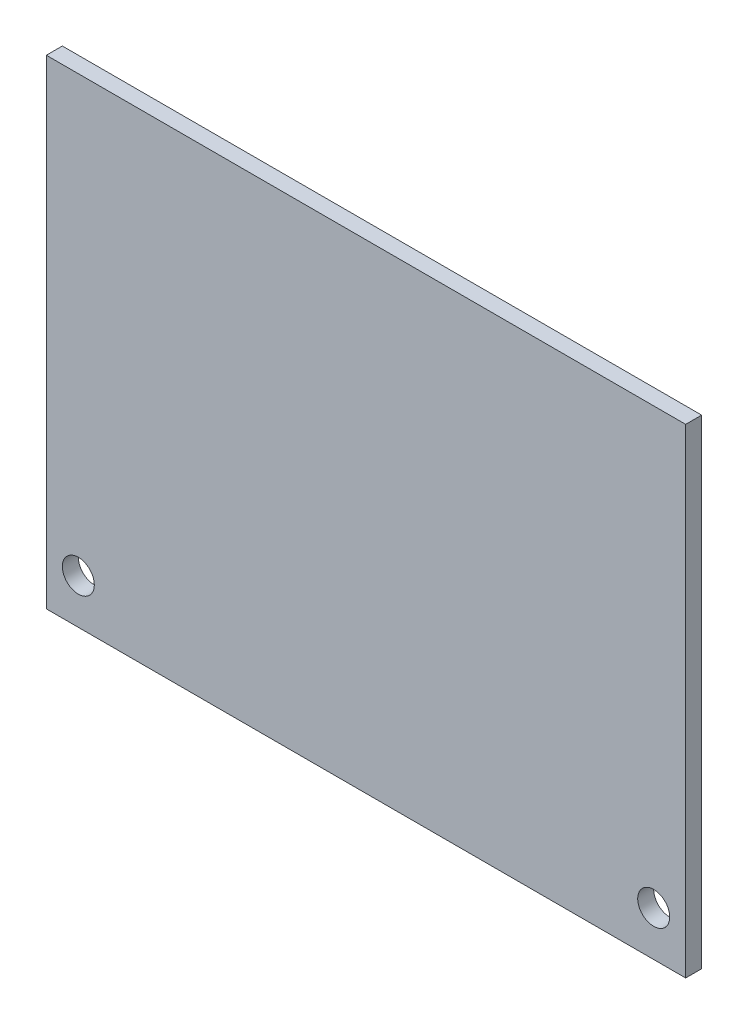
ISO-10303-21;
HEADER;
FILE_DESCRIPTION(('STEP AP214'),'2;1');
FILE_NAME('part.step','',(''),(''),'','','');
FILE_SCHEMA(('AUTOMOTIVE_DESIGN { 1 0 10303 214 1 1 1 1 }'));
ENDSEC;
DATA;
#1=APPLICATION_CONTEXT('core data for automotive mechanical design processes');
#2=APPLICATION_PROTOCOL_DEFINITION('international standard','automotive_design',2000,#1);
#3=PRODUCT_CONTEXT('',#1,'mechanical');
#4=PRODUCT('Part','Part','',(#3));
#5=PRODUCT_RELATED_PRODUCT_CATEGORY('part','',(#4));
#6=PRODUCT_DEFINITION_FORMATION('','',#4);
#7=PRODUCT_DEFINITION_CONTEXT('part definition',#1,'design');
#8=PRODUCT_DEFINITION('design','',#6,#7);
#9=PRODUCT_DEFINITION_SHAPE('','',#8);
#10=(LENGTH_UNIT() NAMED_UNIT(*) SI_UNIT(.MILLI.,.METRE.));
#11=(NAMED_UNIT(*) PLANE_ANGLE_UNIT() SI_UNIT($,.RADIAN.));
#12=(NAMED_UNIT(*) SI_UNIT($,.STERADIAN.) SOLID_ANGLE_UNIT());
#13=UNCERTAINTY_MEASURE_WITH_UNIT(LENGTH_MEASURE(1.E-05),#10,'distance_accuracy_value','');
#14=(GEOMETRIC_REPRESENTATION_CONTEXT(3) GLOBAL_UNCERTAINTY_ASSIGNED_CONTEXT((#13)) GLOBAL_UNIT_ASSIGNED_CONTEXT((#10,
#11,#12)) REPRESENTATION_CONTEXT('',''));
#15=CARTESIAN_POINT('',(0.,0.,0.));
#16=DIRECTION('',(0.,0.,1.));
#17=DIRECTION('',(1.,0.,0.));
#18=AXIS2_PLACEMENT_3D('',#15,#16,#17);
#19=CARTESIAN_POINT('',(20.,-15.,1.));
#20=DIRECTION('',(-1.,0.,0.));
#21=DIRECTION('',(0.,0.,1.));
#22=AXIS2_PLACEMENT_3D('',#19,#20,#21);
#23=PLANE('',#22);
#24=DIRECTION('',(0.,1.,0.));
#25=VECTOR('',#24,1.);
#26=CARTESIAN_POINT('',(20.,-15.,0.));
#27=LINE('',#26,#25);
#28=CARTESIAN_POINT('',(20.,-15.,0.));
#29=VERTEX_POINT('',#28);
#30=CARTESIAN_POINT('',(20.,15.,0.));
#31=VERTEX_POINT('',#30);
#32=EDGE_CURVE('E95',#29,#31,#27,.T.);
#33=ORIENTED_EDGE('',*,*,#32,.T.);
#34=DIRECTION('',(0.,0.,-1.));
#35=VECTOR('',#34,1.);
#36=CARTESIAN_POINT('',(20.,15.,1.));
#37=LINE('',#36,#35);
#38=CARTESIAN_POINT('',(20.,15.,1.));
#39=VERTEX_POINT('',#38);
#40=EDGE_CURVE('E11',#39,#31,#37,.T.);
#41=ORIENTED_EDGE('',*,*,#40,.F.);
#42=DIRECTION('',(0.,1.,0.));
#43=VECTOR('',#42,1.);
#44=CARTESIAN_POINT('',(20.,-15.,1.));
#45=LINE('',#44,#43);
#46=CARTESIAN_POINT('',(20.,-15.,1.));
#47=VERTEX_POINT('',#46);
#48=EDGE_CURVE('E83',#47,#39,#45,.T.);
#49=ORIENTED_EDGE('',*,*,#48,.F.);
#50=DIRECTION('',(0.,0.,-1.));
#51=VECTOR('',#50,1.);
#52=CARTESIAN_POINT('',(20.,-15.,1.));
#53=LINE('',#52,#51);
#54=EDGE_CURVE('E91',#47,#29,#53,.T.);
#55=ORIENTED_EDGE('',*,*,#54,.T.);
#56=EDGE_LOOP('',(#33,#41,#49,#55));
#57=FACE_BOUND('',#56,.T.);
#58=ADVANCED_FACE('F32',(#57),#23,.F.);
#59=CARTESIAN_POINT('',(-20.,15.,1.));
#60=DIRECTION('',(0.,-1.,0.));
#61=DIRECTION('',(0.,0.,-1.));
#62=AXIS2_PLACEMENT_3D('',#59,#60,#61);
#63=PLANE('',#62);
#64=DIRECTION('',(-1.,0.,0.));
#65=VECTOR('',#64,1.);
#66=CARTESIAN_POINT('',(-20.,15.,0.));
#67=LINE('',#66,#65);
#68=CARTESIAN_POINT('',(-20.,15.,0.));
#69=VERTEX_POINT('',#68);
#70=EDGE_CURVE('E87',#31,#69,#67,.T.);
#71=ORIENTED_EDGE('',*,*,#70,.T.);
#72=DIRECTION('',(0.,0.,-1.));
#73=VECTOR('',#72,1.);
#74=CARTESIAN_POINT('',(-20.,15.,1.));
#75=LINE('',#74,#73);
#76=CARTESIAN_POINT('',(-20.,15.,1.));
#77=VERTEX_POINT('',#76);
#78=EDGE_CURVE('E40',#77,#69,#75,.T.);
#79=ORIENTED_EDGE('',*,*,#78,.F.);
#80=DIRECTION('',(-1.,0.,0.));
#81=VECTOR('',#80,1.);
#82=CARTESIAN_POINT('',(-20.,15.,1.));
#83=LINE('',#82,#81);
#84=EDGE_CURVE('E78',#39,#77,#83,.T.);
#85=ORIENTED_EDGE('',*,*,#84,.F.);
#86=ORIENTED_EDGE('',*,*,#40,.T.);
#87=EDGE_LOOP('',(#71,#79,#85,#86));
#88=FACE_BOUND('',#87,.T.);
#89=ADVANCED_FACE('F86',(#88),#63,.F.);
#90=CARTESIAN_POINT('',(-20.,-15.,1.));
#91=DIRECTION('',(1.,0.,0.));
#92=DIRECTION('',(0.,0.,-1.));
#93=AXIS2_PLACEMENT_3D('',#90,#91,#92);
#94=PLANE('',#93);
#95=DIRECTION('',(0.,-1.,0.));
#96=VECTOR('',#95,1.);
#97=CARTESIAN_POINT('',(-20.,-15.,0.));
#98=LINE('',#97,#96);
#99=CARTESIAN_POINT('',(-20.,-15.,0.));
#100=VERTEX_POINT('',#99);
#101=EDGE_CURVE('E65',#69,#100,#98,.T.);
#102=ORIENTED_EDGE('',*,*,#101,.T.);
#103=DIRECTION('',(0.,0.,-1.));
#104=VECTOR('',#103,1.);
#105=CARTESIAN_POINT('',(-20.,-15.,1.));
#106=LINE('',#105,#104);
#107=CARTESIAN_POINT('',(-20.,-15.,1.));
#108=VERTEX_POINT('',#107);
#109=EDGE_CURVE('E88',#108,#100,#106,.T.);
#110=ORIENTED_EDGE('',*,*,#109,.F.);
#111=DIRECTION('',(0.,-1.,0.));
#112=VECTOR('',#111,1.);
#113=CARTESIAN_POINT('',(-20.,-15.,1.));
#114=LINE('',#113,#112);
#115=EDGE_CURVE('E81',#77,#108,#114,.T.);
#116=ORIENTED_EDGE('',*,*,#115,.F.);
#117=ORIENTED_EDGE('',*,*,#78,.T.);
#118=EDGE_LOOP('',(#102,#110,#116,#117));
#119=FACE_BOUND('',#118,.T.);
#120=ADVANCED_FACE('F89',(#119),#94,.F.);
#121=CARTESIAN_POINT('',(-20.,-15.,1.));
#122=DIRECTION('',(0.,1.,0.));
#123=DIRECTION('',(0.,0.,1.));
#124=AXIS2_PLACEMENT_3D('',#121,#122,#123);
#125=PLANE('',#124);
#126=DIRECTION('',(1.,0.,0.));
#127=VECTOR('',#126,1.);
#128=CARTESIAN_POINT('',(-20.,-15.,0.));
#129=LINE('',#128,#127);
#130=EDGE_CURVE('E71',#100,#29,#129,.T.);
#131=ORIENTED_EDGE('',*,*,#130,.T.);
#132=ORIENTED_EDGE('',*,*,#54,.F.);
#133=DIRECTION('',(1.,0.,0.));
#134=VECTOR('',#133,1.);
#135=CARTESIAN_POINT('',(-20.,-15.,1.));
#136=LINE('',#135,#134);
#137=EDGE_CURVE('E48',#108,#47,#136,.T.);
#138=ORIENTED_EDGE('',*,*,#137,.F.);
#139=ORIENTED_EDGE('',*,*,#109,.T.);
#140=EDGE_LOOP('',(#131,#132,#138,#139));
#141=FACE_BOUND('',#140,.T.);
#142=ADVANCED_FACE('F103',(#141),#125,.F.);
#143=CARTESIAN_POINT('',(0.,0.,1.));
#144=DIRECTION('',(0.,0.,-1.));
#145=DIRECTION('',(-1.,0.,0.));
#146=AXIS2_PLACEMENT_3D('',#143,#144,#145);
#147=PLANE('',#146);
#148=CARTESIAN_POINT('',(-18.,-12.2,1.));
#149=DIRECTION('',(0.,0.,1.));
#150=DIRECTION('',(1.,0.,0.));
#151=AXIS2_PLACEMENT_3D('',#148,#149,#150);
#152=CIRCLE('',#151,1.);
#153=CARTESIAN_POINT('',(-17.,-12.2,1.));
#154=VERTEX_POINT('',#153);
#155=EDGE_CURVE('E115',#154,#154,#152,.T.);
#156=ORIENTED_EDGE('',*,*,#155,.F.);
#157=EDGE_LOOP('',(#156));
#158=FACE_BOUND('',#157,.T.);
#159=CARTESIAN_POINT('',(18.,-12.2,1.));
#160=DIRECTION('',(0.,0.,1.));
#161=DIRECTION('',(1.,0.,0.));
#162=AXIS2_PLACEMENT_3D('',#159,#160,#161);
#163=CIRCLE('',#162,1.);
#164=CARTESIAN_POINT('',(19.,-12.2,1.));
#165=VERTEX_POINT('',#164);
#166=EDGE_CURVE('E109',#165,#165,#163,.T.);
#167=ORIENTED_EDGE('',*,*,#166,.F.);
#168=EDGE_LOOP('',(#167));
#169=FACE_BOUND('',#168,.T.);
#170=ORIENTED_EDGE('',*,*,#48,.T.);
#171=ORIENTED_EDGE('',*,*,#84,.T.);
#172=ORIENTED_EDGE('',*,*,#115,.T.);
#173=ORIENTED_EDGE('',*,*,#137,.T.);
#174=EDGE_LOOP('',(#170,#171,#172,#173));
#175=FACE_BOUND('',#174,.T.);
#176=ADVANCED_FACE('F79',(#158,#169,#175),#147,.F.);
#177=CARTESIAN_POINT('',(0.,0.,0.));
#178=DIRECTION('',(0.,0.,-1.));
#179=DIRECTION('',(-1.,0.,0.));
#180=AXIS2_PLACEMENT_3D('',#177,#178,#179);
#181=PLANE('',#180);
#182=CARTESIAN_POINT('',(-18.,-12.2,0.));
#183=DIRECTION('',(0.,0.,1.));
#184=DIRECTION('',(1.,0.,0.));
#185=AXIS2_PLACEMENT_3D('',#182,#183,#184);
#186=CIRCLE('',#185,1.);
#187=CARTESIAN_POINT('',(-17.,-12.2,0.));
#188=VERTEX_POINT('',#187);
#189=EDGE_CURVE('E112',#188,#188,#186,.T.);
#190=ORIENTED_EDGE('',*,*,#189,.T.);
#191=EDGE_LOOP('',(#190));
#192=FACE_BOUND('',#191,.T.);
#193=CARTESIAN_POINT('',(18.,-12.2,0.));
#194=DIRECTION('',(0.,0.,1.));
#195=DIRECTION('',(1.,0.,0.));
#196=AXIS2_PLACEMENT_3D('',#193,#194,#195);
#197=CIRCLE('',#196,1.);
#198=CARTESIAN_POINT('',(19.,-12.2,0.));
#199=VERTEX_POINT('',#198);
#200=EDGE_CURVE('E98',#199,#199,#197,.T.);
#201=ORIENTED_EDGE('',*,*,#200,.T.);
#202=EDGE_LOOP('',(#201));
#203=FACE_BOUND('',#202,.T.);
#204=ORIENTED_EDGE('',*,*,#32,.F.);
#205=ORIENTED_EDGE('',*,*,#130,.F.);
#206=ORIENTED_EDGE('',*,*,#101,.F.);
#207=ORIENTED_EDGE('',*,*,#70,.F.);
#208=EDGE_LOOP('',(#204,#205,#206,#207));
#209=FACE_BOUND('',#208,.T.);
#210=ADVANCED_FACE('F106',(#192,#203,#209),#181,.T.);
#211=CARTESIAN_POINT('',(18.,-12.2,0.));
#212=DIRECTION('',(0.,0.,1.));
#213=DIRECTION('',(1.,0.,0.));
#214=AXIS2_PLACEMENT_3D('',#211,#212,#213);
#215=CYLINDRICAL_SURFACE('',#214,1.);
#216=ORIENTED_EDGE('',*,*,#200,.F.);
#217=EDGE_LOOP('',(#216));
#218=FACE_BOUND('',#217,.T.);
#219=ORIENTED_EDGE('',*,*,#166,.T.);
#220=EDGE_LOOP('',(#219));
#221=FACE_BOUND('',#220,.T.);
#222=ADVANCED_FACE('F126',(#218,#221),#215,.F.);
#223=CARTESIAN_POINT('',(-18.,-12.2,0.));
#224=DIRECTION('',(0.,0.,1.));
#225=DIRECTION('',(1.,0.,0.));
#226=AXIS2_PLACEMENT_3D('',#223,#224,#225);
#227=CYLINDRICAL_SURFACE('',#226,1.);
#228=ORIENTED_EDGE('',*,*,#189,.F.);
#229=EDGE_LOOP('',(#228));
#230=FACE_BOUND('',#229,.T.);
#231=ORIENTED_EDGE('',*,*,#155,.T.);
#232=EDGE_LOOP('',(#231));
#233=FACE_BOUND('',#232,.T.);
#234=ADVANCED_FACE('F123',(#230,#233),#227,.F.);
#235=CLOSED_SHELL('',(#58,#89,#120,#142,#176,#210,#222,#234));
#236=MANIFOLD_SOLID_BREP('B2',#235);
#237=ADVANCED_BREP_SHAPE_REPRESENTATION('',(#18,#236),#14);
#238=SHAPE_DEFINITION_REPRESENTATION(#9,#237);
ENDSEC;
END-ISO-10303-21;
